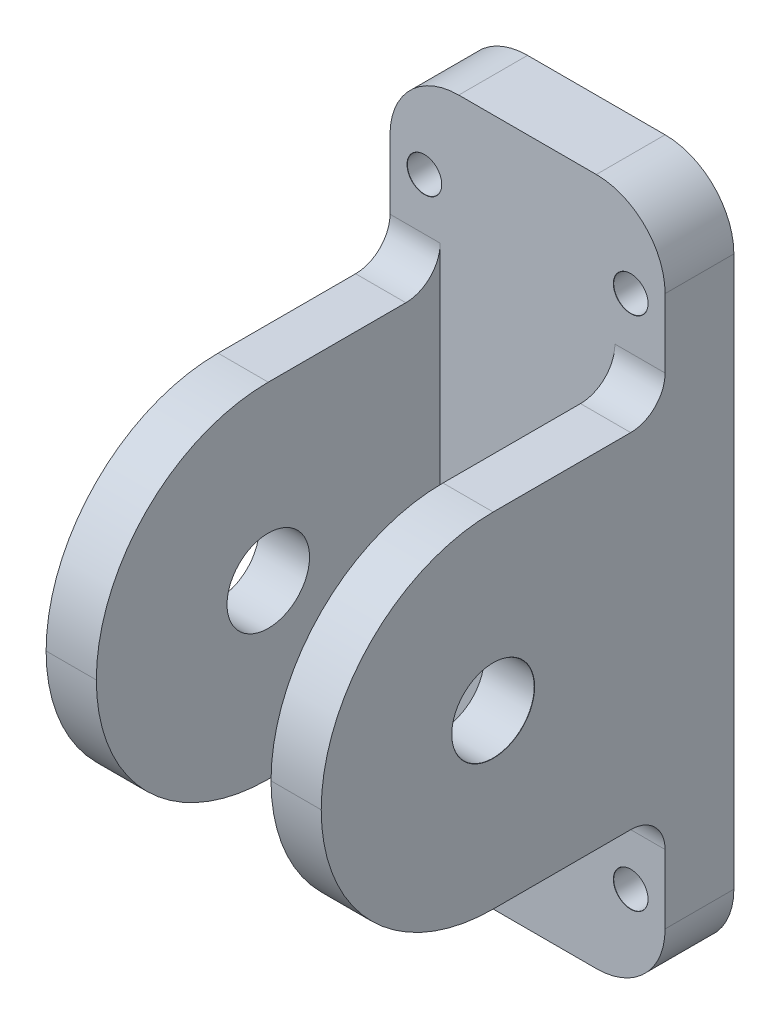
ISO-10303-21;
HEADER;
FILE_DESCRIPTION(('STEP AP214'),'2;1');
FILE_NAME('part.step','',(''),(''),'','','');
FILE_SCHEMA(('AUTOMOTIVE_DESIGN { 1 0 10303 214 1 1 1 1 }'));
ENDSEC;
DATA;
#1=APPLICATION_CONTEXT('core data for automotive mechanical design processes');
#2=APPLICATION_PROTOCOL_DEFINITION('international standard','automotive_design',2000,#1);
#3=PRODUCT_CONTEXT('',#1,'mechanical');
#4=PRODUCT('Part','Part','',(#3));
#5=PRODUCT_RELATED_PRODUCT_CATEGORY('part','',(#4));
#6=PRODUCT_DEFINITION_FORMATION('','',#4);
#7=PRODUCT_DEFINITION_CONTEXT('part definition',#1,'design');
#8=PRODUCT_DEFINITION('design','',#6,#7);
#9=PRODUCT_DEFINITION_SHAPE('','',#8);
#10=(LENGTH_UNIT() NAMED_UNIT(*) SI_UNIT(.MILLI.,.METRE.));
#11=(NAMED_UNIT(*) PLANE_ANGLE_UNIT() SI_UNIT($,.RADIAN.));
#12=(NAMED_UNIT(*) SI_UNIT($,.STERADIAN.) SOLID_ANGLE_UNIT());
#13=UNCERTAINTY_MEASURE_WITH_UNIT(LENGTH_MEASURE(1.E-05),#10,'distance_accuracy_value','');
#14=(GEOMETRIC_REPRESENTATION_CONTEXT(3) GLOBAL_UNCERTAINTY_ASSIGNED_CONTEXT((#13)) GLOBAL_UNIT_ASSIGNED_CONTEXT((#10,
#11,#12)) REPRESENTATION_CONTEXT('',''));
#15=CARTESIAN_POINT('',(0.,0.,0.));
#16=DIRECTION('',(0.,0.,1.));
#17=DIRECTION('',(1.,0.,0.));
#18=AXIS2_PLACEMENT_3D('',#15,#16,#17);
#19=CARTESIAN_POINT('',(0.,0.,0.));
#20=DIRECTION('',(0.,0.,1.));
#21=DIRECTION('',(1.,0.,0.));
#22=AXIS2_PLACEMENT_3D('',#19,#20,#21);
#23=PLANE('',#22);
#24=CARTESIAN_POINT('',(-15.,-37.5,0.));
#25=DIRECTION('',(0.,0.,1.));
#26=DIRECTION('',(1.,0.,0.));
#27=AXIS2_PLACEMENT_3D('',#24,#25,#26);
#28=CIRCLE('',#27,2.525);
#29=CARTESIAN_POINT('',(-12.475,-37.5,0.));
#30=VERTEX_POINT('',#29);
#31=EDGE_CURVE('E416',#30,#30,#28,.T.);
#32=ORIENTED_EDGE('',*,*,#31,.F.);
#33=EDGE_LOOP('',(#32));
#34=FACE_BOUND('',#33,.T.);
#35=CARTESIAN_POINT('',(15.,-37.5,0.));
#36=DIRECTION('',(0.,0.,1.));
#37=DIRECTION('',(1.,0.,0.));
#38=AXIS2_PLACEMENT_3D('',#35,#36,#37);
#39=CIRCLE('',#38,2.525);
#40=CARTESIAN_POINT('',(17.525,-37.5,0.));
#41=VERTEX_POINT('',#40);
#42=EDGE_CURVE('E409',#41,#41,#39,.T.);
#43=ORIENTED_EDGE('',*,*,#42,.F.);
#44=EDGE_LOOP('',(#43));
#45=FACE_BOUND('',#44,.T.);
#46=CARTESIAN_POINT('',(-15.,37.5,0.));
#47=DIRECTION('',(0.,0.,1.));
#48=DIRECTION('',(1.,0.,0.));
#49=AXIS2_PLACEMENT_3D('',#46,#47,#48);
#50=CIRCLE('',#49,2.525);
#51=CARTESIAN_POINT('',(-12.475,37.5,0.));
#52=VERTEX_POINT('',#51);
#53=EDGE_CURVE('E398',#52,#52,#50,.T.);
#54=ORIENTED_EDGE('',*,*,#53,.F.);
#55=EDGE_LOOP('',(#54));
#56=FACE_BOUND('',#55,.T.);
#57=CARTESIAN_POINT('',(15.,37.5,0.));
#58=DIRECTION('',(0.,0.,1.));
#59=DIRECTION('',(1.,0.,0.));
#60=AXIS2_PLACEMENT_3D('',#57,#58,#59);
#61=CIRCLE('',#60,2.525);
#62=CARTESIAN_POINT('',(17.525,37.5,0.));
#63=VERTEX_POINT('',#62);
#64=EDGE_CURVE('E390',#63,#63,#61,.T.);
#65=ORIENTED_EDGE('',*,*,#64,.F.);
#66=EDGE_LOOP('',(#65));
#67=FACE_BOUND('',#66,.T.);
#68=DIRECTION('',(0.,-1.,0.));
#69=VECTOR('',#68,1.);
#70=CARTESIAN_POINT('',(-20.,-50.,0.));
#71=LINE('',#70,#69);
#72=CARTESIAN_POINT('',(-20.,40.,0.));
#73=VERTEX_POINT('',#72);
#74=CARTESIAN_POINT('',(-20.,30.,0.));
#75=VERTEX_POINT('',#74);
#76=EDGE_CURVE('E227',#73,#75,#71,.T.);
#77=ORIENTED_EDGE('',*,*,#76,.T.);
#78=DIRECTION('',(1.,0.,0.));
#79=VECTOR('',#78,1.);
#80=CARTESIAN_POINT('',(-12.7,30.,0.));
#81=LINE('',#80,#79);
#82=CARTESIAN_POINT('',(-12.7,30.,0.));
#83=VERTEX_POINT('',#82);
#84=EDGE_CURVE('E297',#75,#83,#81,.T.);
#85=ORIENTED_EDGE('',*,*,#84,.T.);
#86=DIRECTION('',(0.,1.,0.));
#87=VECTOR('',#86,1.);
#88=CARTESIAN_POINT('',(-12.7,0.,0.));
#89=LINE('',#88,#87);
#90=CARTESIAN_POINT('',(-12.7,-30.,0.));
#91=VERTEX_POINT('',#90);
#92=EDGE_CURVE('E328',#91,#83,#89,.T.);
#93=ORIENTED_EDGE('',*,*,#92,.F.);
#94=DIRECTION('',(1.,0.,0.));
#95=VECTOR('',#94,1.);
#96=CARTESIAN_POINT('',(0.,-30.,0.));
#97=LINE('',#96,#95);
#98=CARTESIAN_POINT('',(-20.,-30.,0.));
#99=VERTEX_POINT('',#98);
#100=EDGE_CURVE('E292',#91,#99,#97,.F.);
#101=ORIENTED_EDGE('',*,*,#100,.T.);
#102=CARTESIAN_POINT('',(-20.,-40.,0.));
#103=VERTEX_POINT('',#102);
#104=EDGE_CURVE('E335',#99,#103,#71,.T.);
#105=ORIENTED_EDGE('',*,*,#104,.T.);
#106=CARTESIAN_POINT('',(-10.,-40.,0.));
#107=DIRECTION('',(0.,0.,1.));
#108=DIRECTION('',(1.,0.,0.));
#109=AXIS2_PLACEMENT_3D('',#106,#107,#108);
#110=CIRCLE('',#109,10.);
#111=CARTESIAN_POINT('',(-10.,-50.,0.));
#112=VERTEX_POINT('',#111);
#113=EDGE_CURVE('E264',#103,#112,#110,.T.);
#114=ORIENTED_EDGE('',*,*,#113,.T.);
#115=DIRECTION('',(1.,0.,0.));
#116=VECTOR('',#115,1.);
#117=CARTESIAN_POINT('',(-20.,-50.,0.));
#118=LINE('',#117,#116);
#119=CARTESIAN_POINT('',(10.,-50.,0.));
#120=VERTEX_POINT('',#119);
#121=EDGE_CURVE('E341',#112,#120,#118,.T.);
#122=ORIENTED_EDGE('',*,*,#121,.T.);
#123=CARTESIAN_POINT('',(10.,-40.,0.));
#124=DIRECTION('',(0.,0.,1.));
#125=DIRECTION('',(1.,0.,0.));
#126=AXIS2_PLACEMENT_3D('',#123,#124,#125);
#127=CIRCLE('',#126,10.);
#128=CARTESIAN_POINT('',(20.,-40.,0.));
#129=VERTEX_POINT('',#128);
#130=EDGE_CURVE('E270',#120,#129,#127,.T.);
#131=ORIENTED_EDGE('',*,*,#130,.T.);
#132=DIRECTION('',(0.,1.,0.));
#133=VECTOR('',#132,1.);
#134=CARTESIAN_POINT('',(20.,-50.,0.));
#135=LINE('',#134,#133);
#136=CARTESIAN_POINT('',(20.,-30.,0.));
#137=VERTEX_POINT('',#136);
#138=EDGE_CURVE('E339',#129,#137,#135,.T.);
#139=ORIENTED_EDGE('',*,*,#138,.T.);
#140=DIRECTION('',(1.,0.,0.));
#141=VECTOR('',#140,1.);
#142=CARTESIAN_POINT('',(0.,-30.,0.));
#143=LINE('',#142,#141);
#144=CARTESIAN_POINT('',(12.7,-30.,0.));
#145=VERTEX_POINT('',#144);
#146=EDGE_CURVE('E295',#137,#145,#143,.F.);
#147=ORIENTED_EDGE('',*,*,#146,.T.);
#148=DIRECTION('',(0.,1.,0.));
#149=VECTOR('',#148,1.);
#150=CARTESIAN_POINT('',(12.7,0.,0.));
#151=LINE('',#150,#149);
#152=CARTESIAN_POINT('',(12.7,30.,0.));
#153=VERTEX_POINT('',#152);
#154=EDGE_CURVE('E211',#145,#153,#151,.T.);
#155=ORIENTED_EDGE('',*,*,#154,.T.);
#156=DIRECTION('',(1.,0.,0.));
#157=VECTOR('',#156,1.);
#158=CARTESIAN_POINT('',(20.,30.,0.));
#159=LINE('',#158,#157);
#160=CARTESIAN_POINT('',(20.,30.,0.));
#161=VERTEX_POINT('',#160);
#162=EDGE_CURVE('E300',#153,#161,#159,.T.);
#163=ORIENTED_EDGE('',*,*,#162,.T.);
#164=CARTESIAN_POINT('',(20.,40.,0.));
#165=VERTEX_POINT('',#164);
#166=EDGE_CURVE('E344',#161,#165,#135,.T.);
#167=ORIENTED_EDGE('',*,*,#166,.T.);
#168=CARTESIAN_POINT('',(10.,40.,0.));
#169=DIRECTION('',(0.,0.,1.));
#170=DIRECTION('',(1.,0.,0.));
#171=AXIS2_PLACEMENT_3D('',#168,#169,#170);
#172=CIRCLE('',#171,10.);
#173=CARTESIAN_POINT('',(10.,50.,0.));
#174=VERTEX_POINT('',#173);
#175=EDGE_CURVE('E263',#165,#174,#172,.T.);
#176=ORIENTED_EDGE('',*,*,#175,.T.);
#177=DIRECTION('',(-1.,0.,0.));
#178=VECTOR('',#177,1.);
#179=CARTESIAN_POINT('',(-20.,50.,0.));
#180=LINE('',#179,#178);
#181=CARTESIAN_POINT('',(-10.,50.,0.));
#182=VERTEX_POINT('',#181);
#183=EDGE_CURVE('E337',#174,#182,#180,.T.);
#184=ORIENTED_EDGE('',*,*,#183,.T.);
#185=CARTESIAN_POINT('',(-10.,40.,0.));
#186=DIRECTION('',(0.,0.,1.));
#187=DIRECTION('',(1.,0.,0.));
#188=AXIS2_PLACEMENT_3D('',#185,#186,#187);
#189=CIRCLE('',#188,10.);
#190=EDGE_CURVE('E261',#182,#73,#189,.T.);
#191=ORIENTED_EDGE('',*,*,#190,.T.);
#192=EDGE_LOOP('',(#77,#85,#93,#101,#105,#114,#122,#131,#139,#147,#155,#163,#167,#176,#184,#191));
#193=FACE_BOUND('',#192,.T.);
#194=ADVANCED_FACE('F41',(#34,#45,#56,#67,#193),#23,.T.);
#195=CARTESIAN_POINT('',(-20.,-50.,-10.));
#196=DIRECTION('',(0.,-1.,0.));
#197=DIRECTION('',(0.,0.,-1.));
#198=AXIS2_PLACEMENT_3D('',#195,#196,#197);
#199=PLANE('',#198);
#200=DIRECTION('',(1.,0.,0.));
#201=VECTOR('',#200,1.);
#202=CARTESIAN_POINT('',(-20.,-50.,-10.));
#203=LINE('',#202,#201);
#204=CARTESIAN_POINT('',(-10.,-50.,-10.));
#205=VERTEX_POINT('',#204);
#206=CARTESIAN_POINT('',(10.,-50.,-10.));
#207=VERTEX_POINT('',#206);
#208=EDGE_CURVE('E340',#205,#207,#203,.T.);
#209=ORIENTED_EDGE('',*,*,#208,.T.);
#210=DIRECTION('',(0.,0.,1.));
#211=VECTOR('',#210,1.);
#212=CARTESIAN_POINT('',(10.,-50.,-10.));
#213=LINE('',#212,#211);
#214=EDGE_CURVE('E257',#207,#120,#213,.T.);
#215=ORIENTED_EDGE('',*,*,#214,.T.);
#216=ORIENTED_EDGE('',*,*,#121,.F.);
#217=DIRECTION('',(0.,0.,1.));
#218=VECTOR('',#217,1.);
#219=CARTESIAN_POINT('',(-10.,-50.,-10.));
#220=LINE('',#219,#218);
#221=EDGE_CURVE('E246',#112,#205,#220,.F.);
#222=ORIENTED_EDGE('',*,*,#221,.T.);
#223=EDGE_LOOP('',(#209,#215,#216,#222));
#224=FACE_BOUND('',#223,.T.);
#225=ADVANCED_FACE('F425',(#224),#199,.T.);
#226=CARTESIAN_POINT('',(-20.,-50.,-10.));
#227=DIRECTION('',(-1.,0.,0.));
#228=DIRECTION('',(0.,-1.,0.));
#229=AXIS2_PLACEMENT_3D('',#226,#227,#228);
#230=PLANE('',#229);
#231=CARTESIAN_POINT('',(-20.,0.,25.));
#232=DIRECTION('',(1.,0.,0.));
#233=DIRECTION('',(0.,0.,-1.));
#234=AXIS2_PLACEMENT_3D('',#231,#232,#233);
#235=CIRCLE('',#234,5.99999999999999);
#236=CARTESIAN_POINT('',(-20.,0.,19.));
#237=VERTEX_POINT('',#236);
#238=EDGE_CURVE('E258',#237,#237,#235,.T.);
#239=ORIENTED_EDGE('',*,*,#238,.T.);
#240=EDGE_LOOP('',(#239));
#241=FACE_BOUND('',#240,.T.);
#242=DIRECTION('',(0.,-1.,0.));
#243=VECTOR('',#242,1.);
#244=CARTESIAN_POINT('',(-20.,-50.,-10.));
#245=LINE('',#244,#243);
#246=CARTESIAN_POINT('',(-20.,40.,-10.));
#247=VERTEX_POINT('',#246);
#248=CARTESIAN_POINT('',(-20.,-40.,-10.));
#249=VERTEX_POINT('',#248);
#250=EDGE_CURVE('E219',#247,#249,#245,.T.);
#251=ORIENTED_EDGE('',*,*,#250,.T.);
#252=DIRECTION('',(0.,0.,1.));
#253=VECTOR('',#252,1.);
#254=CARTESIAN_POINT('',(-20.,-40.,-10.));
#255=LINE('',#254,#253);
#256=EDGE_CURVE('E282',#249,#103,#255,.T.);
#257=ORIENTED_EDGE('',*,*,#256,.T.);
#258=ORIENTED_EDGE('',*,*,#104,.F.);
#259=CARTESIAN_POINT('',(-20.,-30.,5.));
#260=DIRECTION('',(-1.,0.,0.));
#261=DIRECTION('',(0.,-1.,0.));
#262=AXIS2_PLACEMENT_3D('',#259,#260,#261);
#263=CIRCLE('',#262,5.);
#264=CARTESIAN_POINT('',(-20.,-25.,5.));
#265=VERTEX_POINT('',#264);
#266=EDGE_CURVE('E11',#99,#265,#263,.F.);
#267=ORIENTED_EDGE('',*,*,#266,.T.);
#268=DIRECTION('',(0.,0.,-1.));
#269=VECTOR('',#268,1.);
#270=CARTESIAN_POINT('',(-20.,-25.,50.));
#271=LINE('',#270,#269);
#272=CARTESIAN_POINT('',(-20.,-25.,25.));
#273=VERTEX_POINT('',#272);
#274=EDGE_CURVE('E369',#273,#265,#271,.T.);
#275=ORIENTED_EDGE('',*,*,#274,.F.);
#276=CARTESIAN_POINT('',(-20.,0.,25.));
#277=DIRECTION('',(-1.,0.,0.));
#278=DIRECTION('',(0.,-1.,0.));
#279=AXIS2_PLACEMENT_3D('',#276,#277,#278);
#280=CIRCLE('',#279,25.);
#281=CARTESIAN_POINT('',(-20.,0.,50.));
#282=VERTEX_POINT('',#281);
#283=EDGE_CURVE('E239',#273,#282,#280,.T.);
#284=ORIENTED_EDGE('',*,*,#283,.T.);
#285=CARTESIAN_POINT('',(-20.,0.,25.));
#286=DIRECTION('',(-1.,0.,0.));
#287=DIRECTION('',(0.,-1.,0.));
#288=AXIS2_PLACEMENT_3D('',#285,#286,#287);
#289=CIRCLE('',#288,25.);
#290=CARTESIAN_POINT('',(-20.,25.,25.));
#291=VERTEX_POINT('',#290);
#292=EDGE_CURVE('E245',#282,#291,#289,.T.);
#293=ORIENTED_EDGE('',*,*,#292,.T.);
#294=DIRECTION('',(0.,0.,-1.));
#295=VECTOR('',#294,1.);
#296=CARTESIAN_POINT('',(-20.,25.,50.));
#297=LINE('',#296,#295);
#298=CARTESIAN_POINT('',(-20.,25.,5.));
#299=VERTEX_POINT('',#298);
#300=EDGE_CURVE('E370',#291,#299,#297,.T.);
#301=ORIENTED_EDGE('',*,*,#300,.T.);
#302=CARTESIAN_POINT('',(-20.,30.,5.));
#303=DIRECTION('',(-1.,0.,0.));
#304=DIRECTION('',(0.,-1.,0.));
#305=AXIS2_PLACEMENT_3D('',#302,#303,#304);
#306=CIRCLE('',#305,5.);
#307=EDGE_CURVE('E312',#299,#75,#306,.F.);
#308=ORIENTED_EDGE('',*,*,#307,.T.);
#309=ORIENTED_EDGE('',*,*,#76,.F.);
#310=DIRECTION('',(0.,0.,1.));
#311=VECTOR('',#310,1.);
#312=CARTESIAN_POINT('',(-20.,40.,-10.));
#313=LINE('',#312,#311);
#314=EDGE_CURVE('E285',#73,#247,#313,.F.);
#315=ORIENTED_EDGE('',*,*,#314,.T.);
#316=EDGE_LOOP('',(#251,#257,#258,#267,#275,#284,#293,#301,#308,#309,#315));
#317=FACE_BOUND('',#316,.T.);
#318=ADVANCED_FACE('F332',(#241,#317),#230,.T.);
#319=CARTESIAN_POINT('',(-20.,50.,-10.));
#320=DIRECTION('',(0.,1.,0.));
#321=DIRECTION('',(0.,0.,1.));
#322=AXIS2_PLACEMENT_3D('',#319,#320,#321);
#323=PLANE('',#322);
#324=DIRECTION('',(-1.,0.,0.));
#325=VECTOR('',#324,1.);
#326=CARTESIAN_POINT('',(-20.,50.,-10.));
#327=LINE('',#326,#325);
#328=CARTESIAN_POINT('',(10.,50.,-10.));
#329=VERTEX_POINT('',#328);
#330=CARTESIAN_POINT('',(-10.,50.,-10.));
#331=VERTEX_POINT('',#330);
#332=EDGE_CURVE('E222',#329,#331,#327,.T.);
#333=ORIENTED_EDGE('',*,*,#332,.T.);
#334=DIRECTION('',(0.,0.,1.));
#335=VECTOR('',#334,1.);
#336=CARTESIAN_POINT('',(-10.,50.,-10.));
#337=LINE('',#336,#335);
#338=EDGE_CURVE('E287',#331,#182,#337,.T.);
#339=ORIENTED_EDGE('',*,*,#338,.T.);
#340=ORIENTED_EDGE('',*,*,#183,.F.);
#341=DIRECTION('',(0.,0.,1.));
#342=VECTOR('',#341,1.);
#343=CARTESIAN_POINT('',(10.,50.,-10.));
#344=LINE('',#343,#342);
#345=EDGE_CURVE('E290',#174,#329,#344,.F.);
#346=ORIENTED_EDGE('',*,*,#345,.T.);
#347=EDGE_LOOP('',(#333,#339,#340,#346));
#348=FACE_BOUND('',#347,.T.);
#349=ADVANCED_FACE('F487',(#348),#323,.T.);
#350=CARTESIAN_POINT('',(20.,-50.,-10.));
#351=DIRECTION('',(1.,0.,0.));
#352=DIRECTION('',(0.,1.,0.));
#353=AXIS2_PLACEMENT_3D('',#350,#351,#352);
#354=PLANE('',#353);
#355=CARTESIAN_POINT('',(20.,0.,25.));
#356=DIRECTION('',(1.,0.,0.));
#357=DIRECTION('',(0.,0.,-1.));
#358=AXIS2_PLACEMENT_3D('',#355,#356,#357);
#359=CIRCLE('',#358,6.025);
#360=CARTESIAN_POINT('',(20.,0.,18.975));
#361=VERTEX_POINT('',#360);
#362=EDGE_CURVE('E379',#361,#361,#359,.T.);
#363=ORIENTED_EDGE('',*,*,#362,.F.);
#364=EDGE_LOOP('',(#363));
#365=FACE_BOUND('',#364,.T.);
#366=ORIENTED_EDGE('',*,*,#138,.F.);
#367=DIRECTION('',(0.,0.,1.));
#368=VECTOR('',#367,1.);
#369=CARTESIAN_POINT('',(20.,-40.,-10.));
#370=LINE('',#369,#368);
#371=CARTESIAN_POINT('',(20.,-40.,-10.));
#372=VERTEX_POINT('',#371);
#373=EDGE_CURVE('E275',#129,#372,#370,.F.);
#374=ORIENTED_EDGE('',*,*,#373,.T.);
#375=DIRECTION('',(0.,1.,0.));
#376=VECTOR('',#375,1.);
#377=CARTESIAN_POINT('',(20.,-50.,-10.));
#378=LINE('',#377,#376);
#379=CARTESIAN_POINT('',(20.,40.,-10.));
#380=VERTEX_POINT('',#379);
#381=EDGE_CURVE('E349',#372,#380,#378,.T.);
#382=ORIENTED_EDGE('',*,*,#381,.T.);
#383=DIRECTION('',(0.,0.,1.));
#384=VECTOR('',#383,1.);
#385=CARTESIAN_POINT('',(20.,40.,-10.));
#386=LINE('',#385,#384);
#387=EDGE_CURVE('E267',#380,#165,#386,.T.);
#388=ORIENTED_EDGE('',*,*,#387,.T.);
#389=ORIENTED_EDGE('',*,*,#166,.F.);
#390=CARTESIAN_POINT('',(20.,30.,5.));
#391=DIRECTION('',(1.,0.,0.));
#392=DIRECTION('',(0.,1.,0.));
#393=AXIS2_PLACEMENT_3D('',#390,#391,#392);
#394=CIRCLE('',#393,5.);
#395=CARTESIAN_POINT('',(20.,25.,5.));
#396=VERTEX_POINT('',#395);
#397=EDGE_CURVE('E314',#161,#396,#394,.F.);
#398=ORIENTED_EDGE('',*,*,#397,.T.);
#399=DIRECTION('',(0.,0.,-1.));
#400=VECTOR('',#399,1.);
#401=CARTESIAN_POINT('',(20.,25.,50.));
#402=LINE('',#401,#400);
#403=CARTESIAN_POINT('',(20.,25.,25.));
#404=VERTEX_POINT('',#403);
#405=EDGE_CURVE('E215',#404,#396,#402,.T.);
#406=ORIENTED_EDGE('',*,*,#405,.F.);
#407=CARTESIAN_POINT('',(20.,0.,25.));
#408=DIRECTION('',(1.,0.,0.));
#409=DIRECTION('',(0.,1.,0.));
#410=AXIS2_PLACEMENT_3D('',#407,#408,#409);
#411=CIRCLE('',#410,25.);
#412=CARTESIAN_POINT('',(20.,0.,50.));
#413=VERTEX_POINT('',#412);
#414=EDGE_CURVE('E216',#404,#413,#411,.T.);
#415=ORIENTED_EDGE('',*,*,#414,.T.);
#416=CARTESIAN_POINT('',(20.,0.,25.));
#417=DIRECTION('',(1.,0.,0.));
#418=DIRECTION('',(0.,1.,0.));
#419=AXIS2_PLACEMENT_3D('',#416,#417,#418);
#420=CIRCLE('',#419,25.);
#421=CARTESIAN_POINT('',(20.,-25.,25.));
#422=VERTEX_POINT('',#421);
#423=EDGE_CURVE('E217',#413,#422,#420,.T.);
#424=ORIENTED_EDGE('',*,*,#423,.T.);
#425=DIRECTION('',(0.,0.,-1.));
#426=VECTOR('',#425,1.);
#427=CARTESIAN_POINT('',(20.,-25.,50.));
#428=LINE('',#427,#426);
#429=CARTESIAN_POINT('',(20.,-25.,5.));
#430=VERTEX_POINT('',#429);
#431=EDGE_CURVE('E356',#422,#430,#428,.T.);
#432=ORIENTED_EDGE('',*,*,#431,.T.);
#433=CARTESIAN_POINT('',(20.,-30.,5.));
#434=DIRECTION('',(1.,0.,0.));
#435=DIRECTION('',(0.,1.,0.));
#436=AXIS2_PLACEMENT_3D('',#433,#434,#435);
#437=CIRCLE('',#436,5.);
#438=EDGE_CURVE('E316',#430,#137,#437,.F.);
#439=ORIENTED_EDGE('',*,*,#438,.T.);
#440=EDGE_LOOP('',(#366,#374,#382,#388,#389,#398,#406,#415,#424,#432,#439));
#441=FACE_BOUND('',#440,.T.);
#442=ADVANCED_FACE('F485',(#365,#441),#354,.T.);
#443=CARTESIAN_POINT('',(0.,0.,-10.));
#444=DIRECTION('',(0.,0.,1.));
#445=DIRECTION('',(1.,0.,0.));
#446=AXIS2_PLACEMENT_3D('',#443,#444,#445);
#447=PLANE('',#446);
#448=CARTESIAN_POINT('',(-15.,-37.5,-10.));
#449=DIRECTION('',(0.,0.,1.));
#450=DIRECTION('',(1.,0.,0.));
#451=AXIS2_PLACEMENT_3D('',#448,#449,#450);
#452=CIRCLE('',#451,2.5);
#453=CARTESIAN_POINT('',(-12.5,-37.5,-10.));
#454=VERTEX_POINT('',#453);
#455=EDGE_CURVE('E406',#454,#454,#452,.T.);
#456=ORIENTED_EDGE('',*,*,#455,.T.);
#457=EDGE_LOOP('',(#456));
#458=FACE_BOUND('',#457,.T.);
#459=CARTESIAN_POINT('',(15.,-37.5,-10.));
#460=DIRECTION('',(0.,0.,1.));
#461=DIRECTION('',(1.,0.,0.));
#462=AXIS2_PLACEMENT_3D('',#459,#460,#461);
#463=CIRCLE('',#462,2.5);
#464=CARTESIAN_POINT('',(17.5,-37.5,-10.));
#465=VERTEX_POINT('',#464);
#466=EDGE_CURVE('E402',#465,#465,#463,.T.);
#467=ORIENTED_EDGE('',*,*,#466,.T.);
#468=EDGE_LOOP('',(#467));
#469=FACE_BOUND('',#468,.T.);
#470=CARTESIAN_POINT('',(-15.,37.5,-10.));
#471=DIRECTION('',(0.,0.,1.));
#472=DIRECTION('',(1.,0.,0.));
#473=AXIS2_PLACEMENT_3D('',#470,#471,#472);
#474=CIRCLE('',#473,2.5);
#475=CARTESIAN_POINT('',(-12.5,37.5,-10.));
#476=VERTEX_POINT('',#475);
#477=EDGE_CURVE('E395',#476,#476,#474,.T.);
#478=ORIENTED_EDGE('',*,*,#477,.T.);
#479=EDGE_LOOP('',(#478));
#480=FACE_BOUND('',#479,.T.);
#481=CARTESIAN_POINT('',(15.,37.5,-10.));
#482=DIRECTION('',(0.,0.,1.));
#483=DIRECTION('',(1.,0.,0.));
#484=AXIS2_PLACEMENT_3D('',#481,#482,#483);
#485=CIRCLE('',#484,2.5);
#486=CARTESIAN_POINT('',(17.5,37.5,-10.));
#487=VERTEX_POINT('',#486);
#488=EDGE_CURVE('E384',#487,#487,#485,.T.);
#489=ORIENTED_EDGE('',*,*,#488,.T.);
#490=EDGE_LOOP('',(#489));
#491=FACE_BOUND('',#490,.T.);
#492=ORIENTED_EDGE('',*,*,#381,.F.);
#493=CARTESIAN_POINT('',(10.,-40.,-10.));
#494=DIRECTION('',(0.,0.,1.));
#495=DIRECTION('',(1.,0.,0.));
#496=AXIS2_PLACEMENT_3D('',#493,#494,#495);
#497=CIRCLE('',#496,10.);
#498=EDGE_CURVE('E276',#372,#207,#497,.F.);
#499=ORIENTED_EDGE('',*,*,#498,.T.);
#500=ORIENTED_EDGE('',*,*,#208,.F.);
#501=CARTESIAN_POINT('',(-10.,-40.,-10.));
#502=DIRECTION('',(0.,0.,1.));
#503=DIRECTION('',(1.,0.,0.));
#504=AXIS2_PLACEMENT_3D('',#501,#502,#503);
#505=CIRCLE('',#504,10.);
#506=EDGE_CURVE('E277',#205,#249,#505,.F.);
#507=ORIENTED_EDGE('',*,*,#506,.T.);
#508=ORIENTED_EDGE('',*,*,#250,.F.);
#509=CARTESIAN_POINT('',(-10.,40.,-10.));
#510=DIRECTION('',(0.,0.,1.));
#511=DIRECTION('',(1.,0.,0.));
#512=AXIS2_PLACEMENT_3D('',#509,#510,#511);
#513=CIRCLE('',#512,10.);
#514=EDGE_CURVE('E278',#247,#331,#513,.F.);
#515=ORIENTED_EDGE('',*,*,#514,.T.);
#516=ORIENTED_EDGE('',*,*,#332,.F.);
#517=CARTESIAN_POINT('',(10.,40.,-10.));
#518=DIRECTION('',(0.,0.,1.));
#519=DIRECTION('',(1.,0.,0.));
#520=AXIS2_PLACEMENT_3D('',#517,#518,#519);
#521=CIRCLE('',#520,10.);
#522=EDGE_CURVE('E274',#329,#380,#521,.F.);
#523=ORIENTED_EDGE('',*,*,#522,.T.);
#524=EDGE_LOOP('',(#492,#499,#500,#507,#508,#515,#516,#523));
#525=FACE_BOUND('',#524,.T.);
#526=ADVANCED_FACE('F477',(#458,#469,#480,#491,#525),#447,.F.);
#527=CARTESIAN_POINT('',(12.7,0.,50.));
#528=DIRECTION('',(-1.,0.,0.));
#529=DIRECTION('',(0.,-1.,0.));
#530=AXIS2_PLACEMENT_3D('',#527,#528,#529);
#531=PLANE('',#530);
#532=CARTESIAN_POINT('',(12.7,0.,25.));
#533=DIRECTION('',(-1.,0.,0.));
#534=DIRECTION('',(0.,-1.,0.));
#535=AXIS2_PLACEMENT_3D('',#532,#533,#534);
#536=CIRCLE('',#535,5.99999999999999);
#537=CARTESIAN_POINT('',(12.7,-5.99999999999997,25.));
#538=VERTEX_POINT('',#537);
#539=EDGE_CURVE('E255',#538,#538,#536,.T.);
#540=ORIENTED_EDGE('',*,*,#539,.F.);
#541=EDGE_LOOP('',(#540));
#542=FACE_BOUND('',#541,.T.);
#543=CARTESIAN_POINT('',(12.7,0.,25.));
#544=DIRECTION('',(-1.,0.,0.));
#545=DIRECTION('',(0.,-1.,0.));
#546=AXIS2_PLACEMENT_3D('',#543,#544,#545);
#547=CIRCLE('',#546,25.);
#548=CARTESIAN_POINT('',(12.7,-25.,25.));
#549=VERTEX_POINT('',#548);
#550=CARTESIAN_POINT('',(12.7,0.,50.));
#551=VERTEX_POINT('',#550);
#552=EDGE_CURVE('E197',#549,#551,#547,.T.);
#553=ORIENTED_EDGE('',*,*,#552,.T.);
#554=CARTESIAN_POINT('',(12.7,0.,25.));
#555=DIRECTION('',(-1.,0.,0.));
#556=DIRECTION('',(0.,-1.,0.));
#557=AXIS2_PLACEMENT_3D('',#554,#555,#556);
#558=CIRCLE('',#557,25.);
#559=CARTESIAN_POINT('',(12.7,25.,25.));
#560=VERTEX_POINT('',#559);
#561=EDGE_CURVE('E193',#551,#560,#558,.T.);
#562=ORIENTED_EDGE('',*,*,#561,.T.);
#563=DIRECTION('',(0.,0.,-1.));
#564=VECTOR('',#563,1.);
#565=CARTESIAN_POINT('',(12.7,25.,50.));
#566=LINE('',#565,#564);
#567=CARTESIAN_POINT('',(12.7,25.,5.));
#568=VERTEX_POINT('',#567);
#569=EDGE_CURVE('E191',#560,#568,#566,.T.);
#570=ORIENTED_EDGE('',*,*,#569,.T.);
#571=CARTESIAN_POINT('',(12.7,30.,5.));
#572=DIRECTION('',(-1.,0.,0.));
#573=DIRECTION('',(0.,-1.,0.));
#574=AXIS2_PLACEMENT_3D('',#571,#572,#573);
#575=CIRCLE('',#574,5.);
#576=EDGE_CURVE('E320',#568,#153,#575,.F.);
#577=ORIENTED_EDGE('',*,*,#576,.T.);
#578=ORIENTED_EDGE('',*,*,#154,.F.);
#579=CARTESIAN_POINT('',(12.7,-30.,5.));
#580=DIRECTION('',(-1.,0.,0.));
#581=DIRECTION('',(0.,-1.,0.));
#582=AXIS2_PLACEMENT_3D('',#579,#580,#581);
#583=CIRCLE('',#582,5.);
#584=CARTESIAN_POINT('',(12.7,-25.,5.));
#585=VERTEX_POINT('',#584);
#586=EDGE_CURVE('E323',#145,#585,#583,.F.);
#587=ORIENTED_EDGE('',*,*,#586,.T.);
#588=DIRECTION('',(0.,0.,-1.));
#589=VECTOR('',#588,1.);
#590=CARTESIAN_POINT('',(12.7,-25.,50.));
#591=LINE('',#590,#589);
#592=EDGE_CURVE('E354',#549,#585,#591,.T.);
#593=ORIENTED_EDGE('',*,*,#592,.F.);
#594=EDGE_LOOP('',(#553,#562,#570,#577,#578,#587,#593));
#595=FACE_BOUND('',#594,.T.);
#596=ADVANCED_FACE('F192',(#542,#595),#531,.T.);
#597=CARTESIAN_POINT('',(0.,-25.,50.));
#598=DIRECTION('',(0.,1.,0.));
#599=DIRECTION('',(-1.,0.,0.));
#600=AXIS2_PLACEMENT_3D('',#597,#598,#599);
#601=PLANE('',#600);
#602=ORIENTED_EDGE('',*,*,#592,.T.);
#603=DIRECTION('',(1.,0.,0.));
#604=VECTOR('',#603,1.);
#605=CARTESIAN_POINT('',(0.,-25.,5.));
#606=LINE('',#605,#604);
#607=EDGE_CURVE('E306',#585,#430,#606,.T.);
#608=ORIENTED_EDGE('',*,*,#607,.T.);
#609=ORIENTED_EDGE('',*,*,#431,.F.);
#610=DIRECTION('',(1.,0.,0.));
#611=VECTOR('',#610,1.);
#612=CARTESIAN_POINT('',(12.7,-25.,25.));
#613=LINE('',#612,#611);
#614=EDGE_CURVE('E202',#422,#549,#613,.F.);
#615=ORIENTED_EDGE('',*,*,#614,.T.);
#616=EDGE_LOOP('',(#602,#608,#609,#615));
#617=FACE_BOUND('',#616,.T.);
#618=ADVANCED_FACE('F472',(#617),#601,.F.);
#619=CARTESIAN_POINT('',(0.,25.,50.));
#620=DIRECTION('',(0.,1.,0.));
#621=DIRECTION('',(-1.,0.,0.));
#622=AXIS2_PLACEMENT_3D('',#619,#620,#621);
#623=PLANE('',#622);
#624=ORIENTED_EDGE('',*,*,#405,.T.);
#625=DIRECTION('',(1.,0.,0.));
#626=VECTOR('',#625,1.);
#627=CARTESIAN_POINT('',(12.7,25.,5.));
#628=LINE('',#627,#626);
#629=EDGE_CURVE('E212',#396,#568,#628,.F.);
#630=ORIENTED_EDGE('',*,*,#629,.T.);
#631=ORIENTED_EDGE('',*,*,#569,.F.);
#632=DIRECTION('',(1.,0.,0.));
#633=VECTOR('',#632,1.);
#634=CARTESIAN_POINT('',(0.,25.,25.));
#635=LINE('',#634,#633);
#636=EDGE_CURVE('E208',#560,#404,#635,.T.);
#637=ORIENTED_EDGE('',*,*,#636,.T.);
#638=EDGE_LOOP('',(#624,#630,#631,#637));
#639=FACE_BOUND('',#638,.T.);
#640=ADVANCED_FACE('F209',(#639),#623,.T.);
#641=CARTESIAN_POINT('',(0.,-25.,50.));
#642=DIRECTION('',(0.,1.,0.));
#643=DIRECTION('',(-1.,0.,0.));
#644=AXIS2_PLACEMENT_3D('',#641,#642,#643);
#645=PLANE('',#644);
#646=ORIENTED_EDGE('',*,*,#274,.T.);
#647=DIRECTION('',(1.,0.,0.));
#648=VECTOR('',#647,1.);
#649=CARTESIAN_POINT('',(0.,-25.,5.));
#650=LINE('',#649,#648);
#651=CARTESIAN_POINT('',(-12.7,-25.,5.));
#652=VERTEX_POINT('',#651);
#653=EDGE_CURVE('E307',#265,#652,#650,.T.);
#654=ORIENTED_EDGE('',*,*,#653,.T.);
#655=DIRECTION('',(0.,0.,-1.));
#656=VECTOR('',#655,1.);
#657=CARTESIAN_POINT('',(-12.7,-25.,50.));
#658=LINE('',#657,#656);
#659=CARTESIAN_POINT('',(-12.7,-25.,25.));
#660=VERTEX_POINT('',#659);
#661=EDGE_CURVE('E327',#660,#652,#658,.T.);
#662=ORIENTED_EDGE('',*,*,#661,.F.);
#663=DIRECTION('',(1.,0.,0.));
#664=VECTOR('',#663,1.);
#665=CARTESIAN_POINT('',(-20.,-25.,25.));
#666=LINE('',#665,#664);
#667=EDGE_CURVE('E242',#660,#273,#666,.F.);
#668=ORIENTED_EDGE('',*,*,#667,.T.);
#669=EDGE_LOOP('',(#646,#654,#662,#668));
#670=FACE_BOUND('',#669,.T.);
#671=ADVANCED_FACE('F467',(#670),#645,.F.);
#672=CARTESIAN_POINT('',(-12.7,0.,50.));
#673=DIRECTION('',(-1.,0.,0.));
#674=DIRECTION('',(0.,-1.,0.));
#675=AXIS2_PLACEMENT_3D('',#672,#673,#674);
#676=PLANE('',#675);
#677=CARTESIAN_POINT('',(-12.7,0.,25.));
#678=DIRECTION('',(-1.,0.,0.));
#679=DIRECTION('',(0.,-1.,0.));
#680=AXIS2_PLACEMENT_3D('',#677,#678,#679);
#681=CIRCLE('',#680,5.99999999999999);
#682=CARTESIAN_POINT('',(-12.7,-5.99999999999997,25.));
#683=VERTEX_POINT('',#682);
#684=EDGE_CURVE('E254',#683,#683,#681,.T.);
#685=ORIENTED_EDGE('',*,*,#684,.T.);
#686=EDGE_LOOP('',(#685));
#687=FACE_BOUND('',#686,.T.);
#688=DIRECTION('',(0.,0.,-1.));
#689=VECTOR('',#688,1.);
#690=CARTESIAN_POINT('',(-12.7,25.,50.));
#691=LINE('',#690,#689);
#692=CARTESIAN_POINT('',(-12.7,25.,25.));
#693=VERTEX_POINT('',#692);
#694=CARTESIAN_POINT('',(-12.7,25.,5.));
#695=VERTEX_POINT('',#694);
#696=EDGE_CURVE('E364',#693,#695,#691,.T.);
#697=ORIENTED_EDGE('',*,*,#696,.F.);
#698=CARTESIAN_POINT('',(-12.7,0.,25.));
#699=DIRECTION('',(-1.,0.,0.));
#700=DIRECTION('',(0.,-1.,0.));
#701=AXIS2_PLACEMENT_3D('',#698,#699,#700);
#702=CIRCLE('',#701,25.);
#703=CARTESIAN_POINT('',(-12.7,0.,50.));
#704=VERTEX_POINT('',#703);
#705=EDGE_CURVE('E238',#693,#704,#702,.F.);
#706=ORIENTED_EDGE('',*,*,#705,.T.);
#707=CARTESIAN_POINT('',(-12.7,0.,25.));
#708=DIRECTION('',(-1.,0.,0.));
#709=DIRECTION('',(0.,-1.,0.));
#710=AXIS2_PLACEMENT_3D('',#707,#708,#709);
#711=CIRCLE('',#710,25.);
#712=EDGE_CURVE('E236',#704,#660,#711,.F.);
#713=ORIENTED_EDGE('',*,*,#712,.T.);
#714=ORIENTED_EDGE('',*,*,#661,.T.);
#715=CARTESIAN_POINT('',(-12.7,-30.,5.));
#716=DIRECTION('',(-1.,0.,0.));
#717=DIRECTION('',(0.,-1.,0.));
#718=AXIS2_PLACEMENT_3D('',#715,#716,#717);
#719=CIRCLE('',#718,5.);
#720=EDGE_CURVE('E47',#652,#91,#719,.T.);
#721=ORIENTED_EDGE('',*,*,#720,.T.);
#722=ORIENTED_EDGE('',*,*,#92,.T.);
#723=CARTESIAN_POINT('',(-12.7,30.,5.));
#724=DIRECTION('',(-1.,0.,0.));
#725=DIRECTION('',(0.,-1.,0.));
#726=AXIS2_PLACEMENT_3D('',#723,#724,#725);
#727=CIRCLE('',#726,5.);
#728=EDGE_CURVE('E311',#83,#695,#727,.T.);
#729=ORIENTED_EDGE('',*,*,#728,.T.);
#730=EDGE_LOOP('',(#697,#706,#713,#714,#721,#722,#729));
#731=FACE_BOUND('',#730,.T.);
#732=ADVANCED_FACE('F321',(#687,#731),#676,.F.);
#733=CARTESIAN_POINT('',(0.,25.,50.));
#734=DIRECTION('',(0.,1.,0.));
#735=DIRECTION('',(-1.,0.,0.));
#736=AXIS2_PLACEMENT_3D('',#733,#734,#735);
#737=PLANE('',#736);
#738=ORIENTED_EDGE('',*,*,#696,.T.);
#739=DIRECTION('',(1.,0.,0.));
#740=VECTOR('',#739,1.);
#741=CARTESIAN_POINT('',(-20.,25.,5.));
#742=LINE('',#741,#740);
#743=EDGE_CURVE('E303',#695,#299,#742,.F.);
#744=ORIENTED_EDGE('',*,*,#743,.T.);
#745=ORIENTED_EDGE('',*,*,#300,.F.);
#746=DIRECTION('',(1.,0.,0.));
#747=VECTOR('',#746,1.);
#748=CARTESIAN_POINT('',(0.,25.,25.));
#749=LINE('',#748,#747);
#750=EDGE_CURVE('E231',#291,#693,#749,.T.);
#751=ORIENTED_EDGE('',*,*,#750,.T.);
#752=EDGE_LOOP('',(#738,#744,#745,#751));
#753=FACE_BOUND('',#752,.T.);
#754=ADVANCED_FACE('F457',(#753),#737,.T.);
#755=CARTESIAN_POINT('',(0.,0.,25.));
#756=DIRECTION('',(-1.,0.,0.));
#757=DIRECTION('',(0.,-1.,0.));
#758=AXIS2_PLACEMENT_3D('',#755,#756,#757);
#759=CYLINDRICAL_SURFACE('',#758,25.);
#760=DIRECTION('',(1.,0.,0.));
#761=VECTOR('',#760,1.);
#762=CARTESIAN_POINT('',(20.,0.,50.));
#763=LINE('',#762,#761);
#764=EDGE_CURVE('E250',#551,#413,#763,.T.);
#765=ORIENTED_EDGE('',*,*,#764,.F.);
#766=ORIENTED_EDGE('',*,*,#552,.F.);
#767=ORIENTED_EDGE('',*,*,#614,.F.);
#768=ORIENTED_EDGE('',*,*,#423,.F.);
#769=EDGE_LOOP('',(#765,#766,#767,#768));
#770=FACE_BOUND('',#769,.T.);
#771=ADVANCED_FACE('F465',(#770),#759,.T.);
#772=CARTESIAN_POINT('',(0.,0.,25.));
#773=DIRECTION('',(1.,0.,0.));
#774=DIRECTION('',(0.,1.,0.));
#775=AXIS2_PLACEMENT_3D('',#772,#773,#774);
#776=CYLINDRICAL_SURFACE('',#775,25.);
#777=ORIENTED_EDGE('',*,*,#561,.F.);
#778=ORIENTED_EDGE('',*,*,#764,.T.);
#779=ORIENTED_EDGE('',*,*,#414,.F.);
#780=ORIENTED_EDGE('',*,*,#636,.F.);
#781=EDGE_LOOP('',(#777,#778,#779,#780));
#782=FACE_BOUND('',#781,.T.);
#783=ADVANCED_FACE('F220',(#782),#776,.T.);
#784=CARTESIAN_POINT('',(0.,0.,25.));
#785=DIRECTION('',(-1.,0.,0.));
#786=DIRECTION('',(0.,-1.,0.));
#787=AXIS2_PLACEMENT_3D('',#784,#785,#786);
#788=CYLINDRICAL_SURFACE('',#787,25.);
#789=DIRECTION('',(1.,0.,0.));
#790=VECTOR('',#789,1.);
#791=CARTESIAN_POINT('',(-12.7,0.,50.));
#792=LINE('',#791,#790);
#793=EDGE_CURVE('E248',#282,#704,#792,.T.);
#794=ORIENTED_EDGE('',*,*,#793,.F.);
#795=ORIENTED_EDGE('',*,*,#283,.F.);
#796=ORIENTED_EDGE('',*,*,#667,.F.);
#797=ORIENTED_EDGE('',*,*,#712,.F.);
#798=EDGE_LOOP('',(#794,#795,#796,#797));
#799=FACE_BOUND('',#798,.T.);
#800=ADVANCED_FACE('F499',(#799),#788,.T.);
#801=CARTESIAN_POINT('',(0.,0.,25.));
#802=DIRECTION('',(1.,0.,0.));
#803=DIRECTION('',(0.,1.,0.));
#804=AXIS2_PLACEMENT_3D('',#801,#802,#803);
#805=CYLINDRICAL_SURFACE('',#804,25.);
#806=ORIENTED_EDGE('',*,*,#292,.F.);
#807=ORIENTED_EDGE('',*,*,#793,.T.);
#808=ORIENTED_EDGE('',*,*,#705,.F.);
#809=ORIENTED_EDGE('',*,*,#750,.F.);
#810=EDGE_LOOP('',(#806,#807,#808,#809));
#811=FACE_BOUND('',#810,.T.);
#812=ADVANCED_FACE('F502',(#811),#805,.T.);
#813=CARTESIAN_POINT('',(20.,0.,25.));
#814=DIRECTION('',(1.,0.,0.));
#815=DIRECTION('',(0.,0.,-1.));
#816=AXIS2_PLACEMENT_3D('',#813,#814,#815);
#817=CYLINDRICAL_SURFACE('',#816,5.99999999999999);
#818=ORIENTED_EDGE('',*,*,#238,.F.);
#819=EDGE_LOOP('',(#818));
#820=FACE_BOUND('',#819,.T.);
#821=ORIENTED_EDGE('',*,*,#684,.F.);
#822=EDGE_LOOP('',(#821));
#823=FACE_BOUND('',#822,.T.);
#824=ADVANCED_FACE('F460',(#820,#823),#817,.F.);
#825=ORIENTED_EDGE('',*,*,#539,.T.);
#826=EDGE_LOOP('',(#825));
#827=FACE_BOUND('',#826,.T.);
#828=CARTESIAN_POINT('',(19.975,0.,25.));
#829=DIRECTION('',(1.,0.,0.));
#830=DIRECTION('',(0.,0.,-1.));
#831=AXIS2_PLACEMENT_3D('',#828,#829,#830);
#832=CIRCLE('',#831,5.99999999999999);
#833=CARTESIAN_POINT('',(19.975,0.,19.));
#834=VERTEX_POINT('',#833);
#835=EDGE_CURVE('E380',#834,#834,#832,.T.);
#836=ORIENTED_EDGE('',*,*,#835,.T.);
#837=EDGE_LOOP('',(#836));
#838=FACE_BOUND('',#837,.T.);
#839=ADVANCED_FACE('F452',(#827,#838),#817,.F.);
#840=CARTESIAN_POINT('',(20.,0.,25.));
#841=DIRECTION('',(1.,0.,0.));
#842=DIRECTION('',(0.,0.,-1.));
#843=AXIS2_PLACEMENT_3D('',#840,#841,#842);
#844=CONICAL_SURFACE('',#843,6.025,0.785398163397518);
#845=ORIENTED_EDGE('',*,*,#835,.F.);
#846=EDGE_LOOP('',(#845));
#847=FACE_BOUND('',#846,.T.);
#848=ORIENTED_EDGE('',*,*,#362,.T.);
#849=EDGE_LOOP('',(#848));
#850=FACE_BOUND('',#849,.T.);
#851=ADVANCED_FACE('F444',(#847,#850),#844,.F.);
#852=CARTESIAN_POINT('',(15.,37.5,0.));
#853=DIRECTION('',(0.,0.,1.));
#854=DIRECTION('',(1.,0.,0.));
#855=AXIS2_PLACEMENT_3D('',#852,#853,#854);
#856=CYLINDRICAL_SURFACE('',#855,2.5);
#857=ORIENTED_EDGE('',*,*,#488,.F.);
#858=EDGE_LOOP('',(#857));
#859=FACE_BOUND('',#858,.T.);
#860=CARTESIAN_POINT('',(15.,37.5,-0.024999999999999));
#861=DIRECTION('',(0.,0.,1.));
#862=DIRECTION('',(1.,0.,0.));
#863=AXIS2_PLACEMENT_3D('',#860,#861,#862);
#864=CIRCLE('',#863,2.5);
#865=CARTESIAN_POINT('',(17.5,37.5,-0.024999999999999));
#866=VERTEX_POINT('',#865);
#867=EDGE_CURVE('E388',#866,#866,#864,.T.);
#868=ORIENTED_EDGE('',*,*,#867,.T.);
#869=EDGE_LOOP('',(#868));
#870=FACE_BOUND('',#869,.T.);
#871=ADVANCED_FACE('F434',(#859,#870),#856,.F.);
#872=CARTESIAN_POINT('',(15.,37.5,0.));
#873=DIRECTION('',(0.,0.,1.));
#874=DIRECTION('',(1.,0.,0.));
#875=AXIS2_PLACEMENT_3D('',#872,#873,#874);
#876=CONICAL_SURFACE('',#875,2.525,0.785398163397483);
#877=ORIENTED_EDGE('',*,*,#867,.F.);
#878=EDGE_LOOP('',(#877));
#879=FACE_BOUND('',#878,.T.);
#880=ORIENTED_EDGE('',*,*,#64,.T.);
#881=EDGE_LOOP('',(#880));
#882=FACE_BOUND('',#881,.T.);
#883=ADVANCED_FACE('F435',(#879,#882),#876,.F.);
#884=CARTESIAN_POINT('',(-15.,37.5,0.));
#885=DIRECTION('',(0.,0.,1.));
#886=DIRECTION('',(1.,0.,0.));
#887=AXIS2_PLACEMENT_3D('',#884,#885,#886);
#888=CYLINDRICAL_SURFACE('',#887,2.5);
#889=ORIENTED_EDGE('',*,*,#477,.F.);
#890=EDGE_LOOP('',(#889));
#891=FACE_BOUND('',#890,.T.);
#892=CARTESIAN_POINT('',(-15.,37.5,-0.024999999999999));
#893=DIRECTION('',(0.,0.,1.));
#894=DIRECTION('',(1.,0.,0.));
#895=AXIS2_PLACEMENT_3D('',#892,#893,#894);
#896=CIRCLE('',#895,2.5);
#897=CARTESIAN_POINT('',(-12.5,37.5,-0.024999999999999));
#898=VERTEX_POINT('',#897);
#899=EDGE_CURVE('E394',#898,#898,#896,.T.);
#900=ORIENTED_EDGE('',*,*,#899,.T.);
#901=EDGE_LOOP('',(#900));
#902=FACE_BOUND('',#901,.T.);
#903=ADVANCED_FACE('F432',(#891,#902),#888,.F.);
#904=CARTESIAN_POINT('',(-15.,37.5,0.));
#905=DIRECTION('',(0.,0.,1.));
#906=DIRECTION('',(1.,0.,0.));
#907=AXIS2_PLACEMENT_3D('',#904,#905,#906);
#908=CONICAL_SURFACE('',#907,2.525,0.785398163397483);
#909=ORIENTED_EDGE('',*,*,#899,.F.);
#910=EDGE_LOOP('',(#909));
#911=FACE_BOUND('',#910,.T.);
#912=ORIENTED_EDGE('',*,*,#53,.T.);
#913=EDGE_LOOP('',(#912));
#914=FACE_BOUND('',#913,.T.);
#915=ADVANCED_FACE('F445',(#911,#914),#908,.F.);
#916=CARTESIAN_POINT('',(15.,-37.5,0.));
#917=DIRECTION('',(0.,0.,1.));
#918=DIRECTION('',(1.,0.,0.));
#919=AXIS2_PLACEMENT_3D('',#916,#917,#918);
#920=CYLINDRICAL_SURFACE('',#919,2.5);
#921=ORIENTED_EDGE('',*,*,#466,.F.);
#922=EDGE_LOOP('',(#921));
#923=FACE_BOUND('',#922,.T.);
#924=CARTESIAN_POINT('',(15.,-37.5,-0.024999999999999));
#925=DIRECTION('',(0.,0.,1.));
#926=DIRECTION('',(1.,0.,0.));
#927=AXIS2_PLACEMENT_3D('',#924,#925,#926);
#928=CIRCLE('',#927,2.5);
#929=CARTESIAN_POINT('',(17.5,-37.5,-0.024999999999999));
#930=VERTEX_POINT('',#929);
#931=EDGE_CURVE('E404',#930,#930,#928,.T.);
#932=ORIENTED_EDGE('',*,*,#931,.T.);
#933=EDGE_LOOP('',(#932));
#934=FACE_BOUND('',#933,.T.);
#935=ADVANCED_FACE('F653',(#923,#934),#920,.F.);
#936=CARTESIAN_POINT('',(15.,-37.5,0.));
#937=DIRECTION('',(0.,0.,1.));
#938=DIRECTION('',(1.,0.,0.));
#939=AXIS2_PLACEMENT_3D('',#936,#937,#938);
#940=CONICAL_SURFACE('',#939,2.525,0.785398163397483);
#941=ORIENTED_EDGE('',*,*,#931,.F.);
#942=EDGE_LOOP('',(#941));
#943=FACE_BOUND('',#942,.T.);
#944=ORIENTED_EDGE('',*,*,#42,.T.);
#945=EDGE_LOOP('',(#944));
#946=FACE_BOUND('',#945,.T.);
#947=ADVANCED_FACE('F642',(#943,#946),#940,.F.);
#948=CARTESIAN_POINT('',(-15.,-37.5,0.));
#949=DIRECTION('',(0.,0.,1.));
#950=DIRECTION('',(1.,0.,0.));
#951=AXIS2_PLACEMENT_3D('',#948,#949,#950);
#952=CYLINDRICAL_SURFACE('',#951,2.5);
#953=ORIENTED_EDGE('',*,*,#455,.F.);
#954=EDGE_LOOP('',(#953));
#955=FACE_BOUND('',#954,.T.);
#956=CARTESIAN_POINT('',(-15.,-37.5,-0.024999999999999));
#957=DIRECTION('',(0.,0.,1.));
#958=DIRECTION('',(1.,0.,0.));
#959=AXIS2_PLACEMENT_3D('',#956,#957,#958);
#960=CIRCLE('',#959,2.5);
#961=CARTESIAN_POINT('',(-12.5,-37.5,-0.024999999999999));
#962=VERTEX_POINT('',#961);
#963=EDGE_CURVE('E411',#962,#962,#960,.T.);
#964=ORIENTED_EDGE('',*,*,#963,.T.);
#965=EDGE_LOOP('',(#964));
#966=FACE_BOUND('',#965,.T.);
#967=ADVANCED_FACE('F631',(#955,#966),#952,.F.);
#968=CARTESIAN_POINT('',(-15.,-37.5,0.));
#969=DIRECTION('',(0.,0.,1.));
#970=DIRECTION('',(1.,0.,0.));
#971=AXIS2_PLACEMENT_3D('',#968,#969,#970);
#972=CONICAL_SURFACE('',#971,2.525,0.785398163397483);
#973=ORIENTED_EDGE('',*,*,#963,.F.);
#974=EDGE_LOOP('',(#973));
#975=FACE_BOUND('',#974,.T.);
#976=ORIENTED_EDGE('',*,*,#31,.T.);
#977=EDGE_LOOP('',(#976));
#978=FACE_BOUND('',#977,.T.);
#979=ADVANCED_FACE('F419',(#975,#978),#972,.F.);
#980=CARTESIAN_POINT('',(10.,-40.,-10.));
#981=DIRECTION('',(0.,0.,1.));
#982=DIRECTION('',(1.,0.,0.));
#983=AXIS2_PLACEMENT_3D('',#980,#981,#982);
#984=CYLINDRICAL_SURFACE('',#983,10.);
#985=ORIENTED_EDGE('',*,*,#498,.F.);
#986=ORIENTED_EDGE('',*,*,#373,.F.);
#987=ORIENTED_EDGE('',*,*,#130,.F.);
#988=ORIENTED_EDGE('',*,*,#214,.F.);
#989=EDGE_LOOP('',(#985,#986,#987,#988));
#990=FACE_BOUND('',#989,.T.);
#991=ADVANCED_FACE('F512',(#990),#984,.T.);
#992=CARTESIAN_POINT('',(-10.,-40.,-10.));
#993=DIRECTION('',(0.,0.,1.));
#994=DIRECTION('',(1.,0.,0.));
#995=AXIS2_PLACEMENT_3D('',#992,#993,#994);
#996=CYLINDRICAL_SURFACE('',#995,10.);
#997=ORIENTED_EDGE('',*,*,#506,.F.);
#998=ORIENTED_EDGE('',*,*,#221,.F.);
#999=ORIENTED_EDGE('',*,*,#113,.F.);
#1000=ORIENTED_EDGE('',*,*,#256,.F.);
#1001=EDGE_LOOP('',(#997,#998,#999,#1000));
#1002=FACE_BOUND('',#1001,.T.);
#1003=ADVANCED_FACE('F511',(#1002),#996,.T.);
#1004=CARTESIAN_POINT('',(-10.,40.,-10.));
#1005=DIRECTION('',(0.,0.,1.));
#1006=DIRECTION('',(1.,0.,0.));
#1007=AXIS2_PLACEMENT_3D('',#1004,#1005,#1006);
#1008=CYLINDRICAL_SURFACE('',#1007,10.);
#1009=ORIENTED_EDGE('',*,*,#514,.F.);
#1010=ORIENTED_EDGE('',*,*,#314,.F.);
#1011=ORIENTED_EDGE('',*,*,#190,.F.);
#1012=ORIENTED_EDGE('',*,*,#338,.F.);
#1013=EDGE_LOOP('',(#1009,#1010,#1011,#1012));
#1014=FACE_BOUND('',#1013,.T.);
#1015=ADVANCED_FACE('F517',(#1014),#1008,.T.);
#1016=CARTESIAN_POINT('',(10.,40.,-10.));
#1017=DIRECTION('',(0.,0.,1.));
#1018=DIRECTION('',(1.,0.,0.));
#1019=AXIS2_PLACEMENT_3D('',#1016,#1017,#1018);
#1020=CYLINDRICAL_SURFACE('',#1019,10.);
#1021=ORIENTED_EDGE('',*,*,#522,.F.);
#1022=ORIENTED_EDGE('',*,*,#345,.F.);
#1023=ORIENTED_EDGE('',*,*,#175,.F.);
#1024=ORIENTED_EDGE('',*,*,#387,.F.);
#1025=EDGE_LOOP('',(#1021,#1022,#1023,#1024));
#1026=FACE_BOUND('',#1025,.T.);
#1027=ADVANCED_FACE('F525',(#1026),#1020,.T.);
#1028=CARTESIAN_POINT('',(0.,30.,5.));
#1029=DIRECTION('',(-1.,0.,0.));
#1030=DIRECTION('',(0.,-1.,0.));
#1031=AXIS2_PLACEMENT_3D('',#1028,#1029,#1030);
#1032=CYLINDRICAL_SURFACE('',#1031,5.);
#1033=ORIENTED_EDGE('',*,*,#307,.F.);
#1034=ORIENTED_EDGE('',*,*,#743,.F.);
#1035=ORIENTED_EDGE('',*,*,#728,.F.);
#1036=ORIENTED_EDGE('',*,*,#84,.F.);
#1037=EDGE_LOOP('',(#1033,#1034,#1035,#1036));
#1038=FACE_BOUND('',#1037,.T.);
#1039=ADVANCED_FACE('F526',(#1038),#1032,.F.);
#1040=CARTESIAN_POINT('',(0.,30.,5.));
#1041=DIRECTION('',(-1.,0.,0.));
#1042=DIRECTION('',(0.,-1.,0.));
#1043=AXIS2_PLACEMENT_3D('',#1040,#1041,#1042);
#1044=CYLINDRICAL_SURFACE('',#1043,5.);
#1045=ORIENTED_EDGE('',*,*,#576,.F.);
#1046=ORIENTED_EDGE('',*,*,#629,.F.);
#1047=ORIENTED_EDGE('',*,*,#397,.F.);
#1048=ORIENTED_EDGE('',*,*,#162,.F.);
#1049=EDGE_LOOP('',(#1045,#1046,#1047,#1048));
#1050=FACE_BOUND('',#1049,.T.);
#1051=ADVANCED_FACE('F529',(#1050),#1044,.F.);
#1052=CARTESIAN_POINT('',(0.,-30.,5.));
#1053=DIRECTION('',(1.,0.,0.));
#1054=DIRECTION('',(0.,1.,0.));
#1055=AXIS2_PLACEMENT_3D('',#1052,#1053,#1054);
#1056=CYLINDRICAL_SURFACE('',#1055,5.);
#1057=ORIENTED_EDGE('',*,*,#586,.F.);
#1058=ORIENTED_EDGE('',*,*,#146,.F.);
#1059=ORIENTED_EDGE('',*,*,#438,.F.);
#1060=ORIENTED_EDGE('',*,*,#607,.F.);
#1061=EDGE_LOOP('',(#1057,#1058,#1059,#1060));
#1062=FACE_BOUND('',#1061,.T.);
#1063=ADVANCED_FACE('F531',(#1062),#1056,.F.);
#1064=CARTESIAN_POINT('',(0.,-30.,5.));
#1065=DIRECTION('',(1.,0.,0.));
#1066=DIRECTION('',(0.,1.,0.));
#1067=AXIS2_PLACEMENT_3D('',#1064,#1065,#1066);
#1068=CYLINDRICAL_SURFACE('',#1067,5.);
#1069=ORIENTED_EDGE('',*,*,#266,.F.);
#1070=ORIENTED_EDGE('',*,*,#100,.F.);
#1071=ORIENTED_EDGE('',*,*,#720,.F.);
#1072=ORIENTED_EDGE('',*,*,#653,.F.);
#1073=EDGE_LOOP('',(#1069,#1070,#1071,#1072));
#1074=FACE_BOUND('',#1073,.T.);
#1075=ADVANCED_FACE('F43',(#1074),#1068,.F.);
#1076=CLOSED_SHELL('',(#194,#225,#318,#349,#442,#526,#596,#618,#640,#671,#732,#754,#771,#783,
#800,#812,#824,#839,#851,#871,#883,#903,#915,#935,#947,#967,#979,#991,#1003,#1015,#1027,#1039,
#1051,#1063,#1075));
#1077=MANIFOLD_SOLID_BREP('B2',#1076);
#1078=ADVANCED_BREP_SHAPE_REPRESENTATION('',(#18,#1077),#14);
#1079=SHAPE_DEFINITION_REPRESENTATION(#9,#1078);
ENDSEC;
END-ISO-10303-21;
